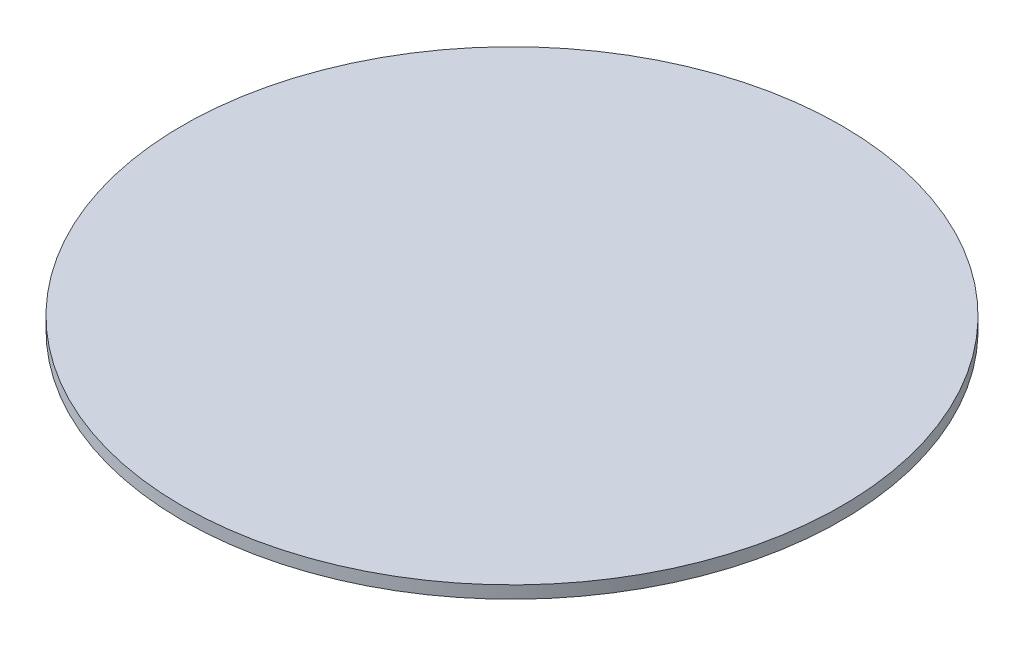
ISO-10303-21;
HEADER;
FILE_DESCRIPTION(('STEP AP214'),'2;1');
FILE_NAME('part.step','',(''),(''),'','','');
FILE_SCHEMA(('AUTOMOTIVE_DESIGN { 1 0 10303 214 1 1 1 1 }'));
ENDSEC;
DATA;
#1=APPLICATION_CONTEXT('core data for automotive mechanical design processes');
#2=APPLICATION_PROTOCOL_DEFINITION('international standard','automotive_design',2000,#1);
#3=PRODUCT_CONTEXT('',#1,'mechanical');
#4=PRODUCT('Part','Part','',(#3));
#5=PRODUCT_RELATED_PRODUCT_CATEGORY('part','',(#4));
#6=PRODUCT_DEFINITION_FORMATION('','',#4);
#7=PRODUCT_DEFINITION_CONTEXT('part definition',#1,'design');
#8=PRODUCT_DEFINITION('design','',#6,#7);
#9=PRODUCT_DEFINITION_SHAPE('','',#8);
#10=(LENGTH_UNIT() NAMED_UNIT(*) SI_UNIT(.MILLI.,.METRE.));
#11=(NAMED_UNIT(*) PLANE_ANGLE_UNIT() SI_UNIT($,.RADIAN.));
#12=(NAMED_UNIT(*) SI_UNIT($,.STERADIAN.) SOLID_ANGLE_UNIT());
#13=UNCERTAINTY_MEASURE_WITH_UNIT(LENGTH_MEASURE(1.E-05),#10,'distance_accuracy_value','');
#14=(GEOMETRIC_REPRESENTATION_CONTEXT(3) GLOBAL_UNCERTAINTY_ASSIGNED_CONTEXT((#13)) GLOBAL_UNIT_ASSIGNED_CONTEXT((#10,
#11,#12)) REPRESENTATION_CONTEXT('',''));
#15=CARTESIAN_POINT('',(0.,0.,0.));
#16=DIRECTION('',(0.,0.,1.));
#17=DIRECTION('',(1.,0.,0.));
#18=AXIS2_PLACEMENT_3D('',#15,#16,#17);
#19=CARTESIAN_POINT('',(0.,6.,0.));
#20=DIRECTION('',(0.,-1.,0.));
#21=DIRECTION('',(0.,0.,-1.));
#22=AXIS2_PLACEMENT_3D('',#19,#20,#21);
#23=CYLINDRICAL_SURFACE('',#22,158.75);
#24=CARTESIAN_POINT('',(0.,6.,0.));
#25=DIRECTION('',(0.,1.,0.));
#26=DIRECTION('',(0.,0.,1.));
#27=AXIS2_PLACEMENT_3D('',#24,#25,#26);
#28=CIRCLE('',#27,158.75);
#29=CARTESIAN_POINT('',(0.,6.,158.75));
#30=VERTEX_POINT('',#29);
#31=EDGE_CURVE('E10',#30,#30,#28,.T.);
#32=ORIENTED_EDGE('',*,*,#31,.F.);
#33=EDGE_LOOP('',(#32));
#34=FACE_BOUND('',#33,.T.);
#35=CARTESIAN_POINT('',(0.,0.,0.));
#36=DIRECTION('',(0.,1.,0.));
#37=DIRECTION('',(0.,0.,1.));
#38=AXIS2_PLACEMENT_3D('',#35,#36,#37);
#39=CIRCLE('',#38,158.75);
#40=CARTESIAN_POINT('',(0.,0.,158.75));
#41=VERTEX_POINT('',#40);
#42=EDGE_CURVE('E34',#41,#41,#39,.T.);
#43=ORIENTED_EDGE('',*,*,#42,.T.);
#44=EDGE_LOOP('',(#43));
#45=FACE_BOUND('',#44,.T.);
#46=ADVANCED_FACE('F31',(#34,#45),#23,.T.);
#47=CARTESIAN_POINT('',(0.,6.,0.));
#48=DIRECTION('',(0.,1.,0.));
#49=DIRECTION('',(0.,0.,1.));
#50=AXIS2_PLACEMENT_3D('',#47,#48,#49);
#51=PLANE('',#50);
#52=ORIENTED_EDGE('',*,*,#31,.T.);
#53=EDGE_LOOP('',(#52));
#54=FACE_BOUND('',#53,.T.);
#55=ADVANCED_FACE('F46',(#54),#51,.T.);
#56=CARTESIAN_POINT('',(0.,0.,0.));
#57=DIRECTION('',(0.,1.,0.));
#58=DIRECTION('',(0.,0.,1.));
#59=AXIS2_PLACEMENT_3D('',#56,#57,#58);
#60=PLANE('',#59);
#61=ORIENTED_EDGE('',*,*,#42,.F.);
#62=EDGE_LOOP('',(#61));
#63=FACE_BOUND('',#62,.T.);
#64=ADVANCED_FACE('F44',(#63),#60,.F.);
#65=CLOSED_SHELL('',(#46,#55,#64));
#66=MANIFOLD_SOLID_BREP('B2',#65);
#67=ADVANCED_BREP_SHAPE_REPRESENTATION('',(#18,#66),#14);
#68=SHAPE_DEFINITION_REPRESENTATION(#9,#67);
ENDSEC;
END-ISO-10303-21;
